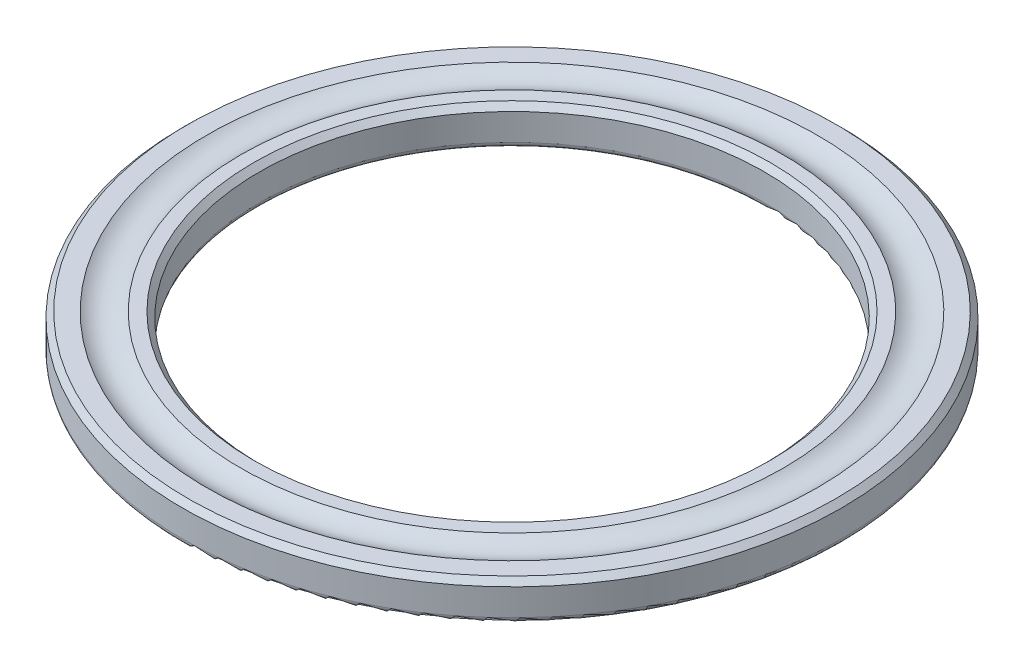
ISO-10303-21;
HEADER;
FILE_DESCRIPTION(('STEP AP214'),'2;1');
FILE_NAME('part.step','',(''),(''),'','','');
FILE_SCHEMA(('AUTOMOTIVE_DESIGN { 1 0 10303 214 1 1 1 1 }'));
ENDSEC;
DATA;
#1=APPLICATION_CONTEXT('core data for automotive mechanical design processes');
#2=APPLICATION_PROTOCOL_DEFINITION('international standard','automotive_design',2000,#1);
#3=PRODUCT_CONTEXT('',#1,'mechanical');
#4=PRODUCT('Part','Part','',(#3));
#5=PRODUCT_RELATED_PRODUCT_CATEGORY('part','',(#4));
#6=PRODUCT_DEFINITION_FORMATION('','',#4);
#7=PRODUCT_DEFINITION_CONTEXT('part definition',#1,'design');
#8=PRODUCT_DEFINITION('design','',#6,#7);
#9=PRODUCT_DEFINITION_SHAPE('','',#8);
#10=(LENGTH_UNIT() NAMED_UNIT(*) SI_UNIT(.MILLI.,.METRE.));
#11=(NAMED_UNIT(*) PLANE_ANGLE_UNIT() SI_UNIT($,.RADIAN.));
#12=(NAMED_UNIT(*) SI_UNIT($,.STERADIAN.) SOLID_ANGLE_UNIT());
#13=UNCERTAINTY_MEASURE_WITH_UNIT(LENGTH_MEASURE(1.E-05),#10,'distance_accuracy_value','');
#14=(GEOMETRIC_REPRESENTATION_CONTEXT(3) GLOBAL_UNCERTAINTY_ASSIGNED_CONTEXT((#13)) GLOBAL_UNIT_ASSIGNED_CONTEXT((#10,
#11,#12)) REPRESENTATION_CONTEXT('',''));
#15=CARTESIAN_POINT('',(0.,0.,0.));
#16=DIRECTION('',(0.,0.,1.));
#17=DIRECTION('',(1.,0.,0.));
#18=AXIS2_PLACEMENT_3D('',#15,#16,#17);
#19=CARTESIAN_POINT('',(53.,0.,0.));
#20=DIRECTION('',(0.,-1.,0.));
#21=DIRECTION('',(-1.,0.,0.));
#22=AXIS2_PLACEMENT_3D('',#19,#20,#21);
#23=PLANE('',#22);
#24=CARTESIAN_POINT('',(0.,0.,0.));
#25=DIRECTION('',(0.,1.,0.));
#26=DIRECTION('',(1.,0.,0.));
#27=AXIS2_PLACEMENT_3D('',#24,#25,#26);
#28=CIRCLE('',#27,47.);
#29=CARTESIAN_POINT('',(47.,0.,0.));
#30=VERTEX_POINT('',#29);
#31=EDGE_CURVE('E10',#30,#30,#28,.T.);
#32=ORIENTED_EDGE('',*,*,#31,.T.);
#33=EDGE_LOOP('',(#32));
#34=FACE_BOUND('',#33,.T.);
#35=CARTESIAN_POINT('',(0.,0.,0.));
#36=DIRECTION('',(0.,1.,0.));
#37=DIRECTION('',(1.,0.,0.));
#38=AXIS2_PLACEMENT_3D('',#35,#36,#37);
#39=CIRCLE('',#38,59.);
#40=CARTESIAN_POINT('',(59.,0.,0.));
#41=VERTEX_POINT('',#40);
#42=EDGE_CURVE('E79',#41,#41,#39,.T.);
#43=ORIENTED_EDGE('',*,*,#42,.F.);
#44=EDGE_LOOP('',(#43));
#45=FACE_BOUND('',#44,.T.);
#46=ADVANCED_FACE('F15',(#34,#45),#23,.T.);
#47=CARTESIAN_POINT('',(0.,1.,0.));
#48=DIRECTION('',(0.,1.,0.));
#49=DIRECTION('',(0.,0.,1.));
#50=AXIS2_PLACEMENT_3D('',#47,#48,#49);
#51=TOROIDAL_SURFACE('',#50,47.,1.);
#52=CARTESIAN_POINT('',(0.,1.,0.));
#53=DIRECTION('',(0.,1.,0.));
#54=DIRECTION('',(1.,0.,0.));
#55=AXIS2_PLACEMENT_3D('',#52,#53,#54);
#56=CIRCLE('',#55,46.);
#57=CARTESIAN_POINT('',(46.,1.,0.));
#58=VERTEX_POINT('',#57);
#59=EDGE_CURVE('E19',#58,#58,#56,.T.);
#60=ORIENTED_EDGE('',*,*,#59,.T.);
#61=EDGE_LOOP('',(#60));
#62=FACE_BOUND('',#61,.T.);
#63=ORIENTED_EDGE('',*,*,#31,.F.);
#64=EDGE_LOOP('',(#63));
#65=FACE_BOUND('',#64,.T.);
#66=ADVANCED_FACE('F89',(#62,#65),#51,.T.);
#67=CARTESIAN_POINT('',(0.,3.4362,0.));
#68=DIRECTION('',(0.,-1.,0.));
#69=DIRECTION('',(1.,0.,0.));
#70=AXIS2_PLACEMENT_3D('',#67,#68,#69);
#71=CYLINDRICAL_SURFACE('',#70,46.);
#72=CARTESIAN_POINT('',(0.,5.8724,0.));
#73=DIRECTION('',(0.,1.,0.));
#74=DIRECTION('',(1.,0.,0.));
#75=AXIS2_PLACEMENT_3D('',#72,#73,#74);
#76=CIRCLE('',#75,46.);
#77=CARTESIAN_POINT('',(46.,5.8724,0.));
#78=VERTEX_POINT('',#77);
#79=EDGE_CURVE('E72',#78,#78,#76,.T.);
#80=ORIENTED_EDGE('',*,*,#79,.T.);
#81=EDGE_LOOP('',(#80));
#82=FACE_BOUND('',#81,.T.);
#83=ORIENTED_EDGE('',*,*,#59,.F.);
#84=EDGE_LOOP('',(#83));
#85=FACE_BOUND('',#84,.T.);
#86=ADVANCED_FACE('F95',(#82,#85),#71,.F.);
#87=CARTESIAN_POINT('',(0.,6.3724,0.));
#88=DIRECTION('',(0.,1.,0.));
#89=DIRECTION('',(1.,0.,0.));
#90=AXIS2_PLACEMENT_3D('',#87,#88,#89);
#91=CONICAL_SURFACE('',#90,46.5,0.785398163397445);
#92=CARTESIAN_POINT('',(0.,6.8724,0.));
#93=DIRECTION('',(0.,1.,0.));
#94=DIRECTION('',(1.,0.,0.));
#95=AXIS2_PLACEMENT_3D('',#92,#93,#94);
#96=CIRCLE('',#95,47.);
#97=CARTESIAN_POINT('',(47.,6.8724,0.));
#98=VERTEX_POINT('',#97);
#99=EDGE_CURVE('E62',#98,#98,#96,.T.);
#100=ORIENTED_EDGE('',*,*,#99,.T.);
#101=EDGE_LOOP('',(#100));
#102=FACE_BOUND('',#101,.T.);
#103=ORIENTED_EDGE('',*,*,#79,.F.);
#104=EDGE_LOOP('',(#103));
#105=FACE_BOUND('',#104,.T.);
#106=ADVANCED_FACE('F17',(#102,#105),#91,.F.);
#107=CARTESIAN_POINT('',(48.20215,6.8724,0.));
#108=DIRECTION('',(0.,1.,0.));
#109=DIRECTION('',(1.,0.,0.));
#110=AXIS2_PLACEMENT_3D('',#107,#108,#109);
#111=PLANE('',#110);
#112=CARTESIAN_POINT('',(0.,6.8724,0.));
#113=DIRECTION('',(0.,1.,0.));
#114=DIRECTION('',(1.,0.,0.));
#115=AXIS2_PLACEMENT_3D('',#112,#113,#114);
#116=CIRCLE('',#115,49.4043);
#117=CARTESIAN_POINT('',(49.4043,6.8724,0.));
#118=VERTEX_POINT('',#117);
#119=EDGE_CURVE('E66',#118,#118,#116,.T.);
#120=ORIENTED_EDGE('',*,*,#119,.T.);
#121=EDGE_LOOP('',(#120));
#122=FACE_BOUND('',#121,.T.);
#123=ORIENTED_EDGE('',*,*,#99,.F.);
#124=EDGE_LOOP('',(#123));
#125=FACE_BOUND('',#124,.T.);
#126=ADVANCED_FACE('F67',(#122,#125),#111,.T.);
#127=CARTESIAN_POINT('',(0.,11.,0.));
#128=DIRECTION('',(0.,1.,0.));
#129=DIRECTION('',(0.,0.,1.));
#130=AXIS2_PLACEMENT_3D('',#127,#128,#129);
#131=TOROIDAL_SURFACE('',#130,52.5,5.1595);
#132=CARTESIAN_POINT('',(0.,6.8724,0.));
#133=DIRECTION('',(0.,1.,0.));
#134=DIRECTION('',(1.,0.,0.));
#135=AXIS2_PLACEMENT_3D('',#132,#133,#134);
#136=CIRCLE('',#135,55.5957);
#137=CARTESIAN_POINT('',(55.5957,6.8724,0.));
#138=VERTEX_POINT('',#137);
#139=EDGE_CURVE('E70',#138,#138,#136,.T.);
#140=ORIENTED_EDGE('',*,*,#139,.T.);
#141=EDGE_LOOP('',(#140));
#142=FACE_BOUND('',#141,.T.);
#143=ORIENTED_EDGE('',*,*,#119,.F.);
#144=EDGE_LOOP('',(#143));
#145=FACE_BOUND('',#144,.T.);
#146=ADVANCED_FACE('F99',(#142,#145),#131,.F.);
#147=CARTESIAN_POINT('',(57.29785,6.8724,0.));
#148=DIRECTION('',(0.,1.,0.));
#149=DIRECTION('',(1.,0.,0.));
#150=AXIS2_PLACEMENT_3D('',#147,#148,#149);
#151=PLANE('',#150);
#152=CARTESIAN_POINT('',(0.,6.8724,0.));
#153=DIRECTION('',(0.,1.,0.));
#154=DIRECTION('',(1.,0.,0.));
#155=AXIS2_PLACEMENT_3D('',#152,#153,#154);
#156=CIRCLE('',#155,59.);
#157=CARTESIAN_POINT('',(59.,6.8724,0.));
#158=VERTEX_POINT('',#157);
#159=EDGE_CURVE('E48',#158,#158,#156,.T.);
#160=ORIENTED_EDGE('',*,*,#159,.T.);
#161=EDGE_LOOP('',(#160));
#162=FACE_BOUND('',#161,.T.);
#163=ORIENTED_EDGE('',*,*,#139,.F.);
#164=EDGE_LOOP('',(#163));
#165=FACE_BOUND('',#164,.T.);
#166=ADVANCED_FACE('F102',(#162,#165),#151,.T.);
#167=CARTESIAN_POINT('',(0.,6.3724,0.));
#168=DIRECTION('',(0.,-1.,0.));
#169=DIRECTION('',(1.,0.,0.));
#170=AXIS2_PLACEMENT_3D('',#167,#168,#169);
#171=CONICAL_SURFACE('',#170,59.5,0.785398163397448);
#172=CARTESIAN_POINT('',(0.,5.8724,0.));
#173=DIRECTION('',(0.,1.,0.));
#174=DIRECTION('',(1.,0.,0.));
#175=AXIS2_PLACEMENT_3D('',#172,#173,#174);
#176=CIRCLE('',#175,60.);
#177=CARTESIAN_POINT('',(60.,5.8724,0.));
#178=VERTEX_POINT('',#177);
#179=EDGE_CURVE('E55',#178,#178,#176,.T.);
#180=ORIENTED_EDGE('',*,*,#179,.T.);
#181=EDGE_LOOP('',(#180));
#182=FACE_BOUND('',#181,.T.);
#183=ORIENTED_EDGE('',*,*,#159,.F.);
#184=EDGE_LOOP('',(#183));
#185=FACE_BOUND('',#184,.T.);
#186=ADVANCED_FACE('F104',(#182,#185),#171,.T.);
#187=CARTESIAN_POINT('',(0.,3.4362,0.));
#188=DIRECTION('',(0.,-1.,0.));
#189=DIRECTION('',(1.,0.,0.));
#190=AXIS2_PLACEMENT_3D('',#187,#188,#189);
#191=CYLINDRICAL_SURFACE('',#190,60.);
#192=CARTESIAN_POINT('',(0.,1.,0.));
#193=DIRECTION('',(0.,1.,0.));
#194=DIRECTION('',(1.,0.,0.));
#195=AXIS2_PLACEMENT_3D('',#192,#193,#194);
#196=CIRCLE('',#195,60.);
#197=CARTESIAN_POINT('',(60.,1.,0.));
#198=VERTEX_POINT('',#197);
#199=EDGE_CURVE('E78',#198,#198,#196,.T.);
#200=ORIENTED_EDGE('',*,*,#199,.T.);
#201=EDGE_LOOP('',(#200));
#202=FACE_BOUND('',#201,.T.);
#203=ORIENTED_EDGE('',*,*,#179,.F.);
#204=EDGE_LOOP('',(#203));
#205=FACE_BOUND('',#204,.T.);
#206=ADVANCED_FACE('F107',(#202,#205),#191,.T.);
#207=CARTESIAN_POINT('',(0.,1.,0.));
#208=DIRECTION('',(0.,1.,0.));
#209=DIRECTION('',(0.,0.,1.));
#210=AXIS2_PLACEMENT_3D('',#207,#208,#209);
#211=TOROIDAL_SURFACE('',#210,59.,1.);
#212=ORIENTED_EDGE('',*,*,#42,.T.);
#213=EDGE_LOOP('',(#212));
#214=FACE_BOUND('',#213,.T.);
#215=ORIENTED_EDGE('',*,*,#199,.F.);
#216=EDGE_LOOP('',(#215));
#217=FACE_BOUND('',#216,.T.);
#218=ADVANCED_FACE('F85',(#214,#217),#211,.T.);
#219=CLOSED_SHELL('',(#46,#66,#86,#106,#126,#146,#166,#186,#206,#218));
#220=MANIFOLD_SOLID_BREP('B1',#219);
#221=ADVANCED_BREP_SHAPE_REPRESENTATION('',(#18,#220),#14);
#222=SHAPE_DEFINITION_REPRESENTATION(#9,#221);
ENDSEC;
END-ISO-10303-21;
